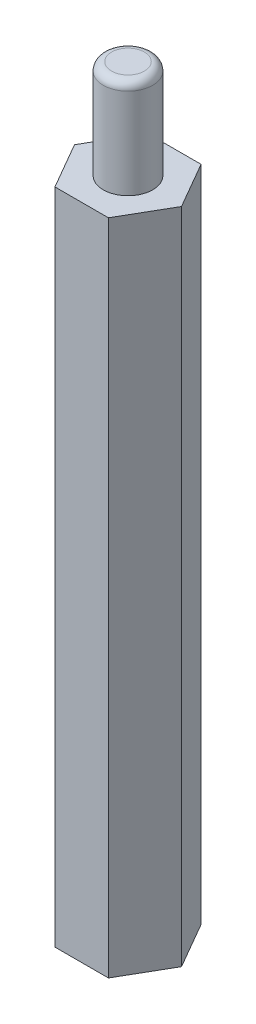
ISO-10303-21;
HEADER;
FILE_DESCRIPTION(('STEP AP214'),'2;1');
FILE_NAME('part.step','',(''),(''),'','','');
FILE_SCHEMA(('AUTOMOTIVE_DESIGN { 1 0 10303 214 1 1 1 1 }'));
ENDSEC;
DATA;
#1=APPLICATION_CONTEXT('core data for automotive mechanical design processes');
#2=APPLICATION_PROTOCOL_DEFINITION('international standard','automotive_design',2000,#1);
#3=PRODUCT_CONTEXT('',#1,'mechanical');
#4=PRODUCT('Part','Part','',(#3));
#5=PRODUCT_RELATED_PRODUCT_CATEGORY('part','',(#4));
#6=PRODUCT_DEFINITION_FORMATION('','',#4);
#7=PRODUCT_DEFINITION_CONTEXT('part definition',#1,'design');
#8=PRODUCT_DEFINITION('design','',#6,#7);
#9=PRODUCT_DEFINITION_SHAPE('','',#8);
#10=(LENGTH_UNIT() NAMED_UNIT(*) SI_UNIT(.MILLI.,.METRE.));
#11=(NAMED_UNIT(*) PLANE_ANGLE_UNIT() SI_UNIT($,.RADIAN.));
#12=(NAMED_UNIT(*) SI_UNIT($,.STERADIAN.) SOLID_ANGLE_UNIT());
#13=UNCERTAINTY_MEASURE_WITH_UNIT(LENGTH_MEASURE(1.E-05),#10,'distance_accuracy_value','');
#14=(GEOMETRIC_REPRESENTATION_CONTEXT(3) GLOBAL_UNCERTAINTY_ASSIGNED_CONTEXT((#13)) GLOBAL_UNIT_ASSIGNED_CONTEXT((#10,
#11,#12)) REPRESENTATION_CONTEXT('',''));
#15=CARTESIAN_POINT('',(0.,0.,0.));
#16=DIRECTION('',(0.,0.,1.));
#17=DIRECTION('',(1.,0.,0.));
#18=AXIS2_PLACEMENT_3D('',#15,#16,#17);
#19=CARTESIAN_POINT('',(0.,46.,0.));
#20=DIRECTION('',(0.,-1.,0.));
#21=DIRECTION('',(0.,0.,-1.));
#22=AXIS2_PLACEMENT_3D('',#19,#20,#21);
#23=CYLINDRICAL_SURFACE('',#22,1.5);
#24=CARTESIAN_POINT('',(0.,40.,0.));
#25=DIRECTION('',(0.,1.,0.));
#26=DIRECTION('',(0.,0.,1.));
#27=AXIS2_PLACEMENT_3D('',#24,#25,#26);
#28=CIRCLE('',#27,1.5);
#29=CARTESIAN_POINT('',(0.,40.,1.5));
#30=VERTEX_POINT('',#29);
#31=EDGE_CURVE('E138',#30,#30,#28,.T.);
#32=ORIENTED_EDGE('',*,*,#31,.T.);
#33=EDGE_LOOP('',(#32));
#34=FACE_BOUND('',#33,.T.);
#35=CARTESIAN_POINT('',(0.,45.5,0.));
#36=DIRECTION('',(0.,1.,0.));
#37=DIRECTION('',(0.,0.,1.));
#38=AXIS2_PLACEMENT_3D('',#35,#36,#37);
#39=CIRCLE('',#38,1.5);
#40=CARTESIAN_POINT('',(0.,45.5,1.5));
#41=VERTEX_POINT('',#40);
#42=EDGE_CURVE('E11',#41,#41,#39,.F.);
#43=ORIENTED_EDGE('',*,*,#42,.T.);
#44=EDGE_LOOP('',(#43));
#45=FACE_BOUND('',#44,.T.);
#46=ADVANCED_FACE('F41',(#34,#45),#23,.T.);
#47=CARTESIAN_POINT('',(0.,46.,0.));
#48=DIRECTION('',(0.,1.,0.));
#49=DIRECTION('',(0.,0.,1.));
#50=AXIS2_PLACEMENT_3D('',#47,#48,#49);
#51=PLANE('',#50);
#52=CARTESIAN_POINT('',(0.,46.,0.));
#53=DIRECTION('',(0.,1.,0.));
#54=DIRECTION('',(0.,0.,1.));
#55=AXIS2_PLACEMENT_3D('',#52,#53,#54);
#56=CIRCLE('',#55,1.);
#57=CARTESIAN_POINT('',(0.,46.,1.));
#58=VERTEX_POINT('',#57);
#59=EDGE_CURVE('E51',#58,#58,#56,.T.);
#60=ORIENTED_EDGE('',*,*,#59,.T.);
#61=EDGE_LOOP('',(#60));
#62=FACE_BOUND('',#61,.T.);
#63=ADVANCED_FACE('F167',(#62),#51,.T.);
#64=CARTESIAN_POINT('',(0.,45.5,0.));
#65=DIRECTION('',(0.,1.,0.));
#66=DIRECTION('',(0.,0.,1.));
#67=AXIS2_PLACEMENT_3D('',#64,#65,#66);
#68=TOROIDAL_SURFACE('',#67,1.,0.5);
#69=ORIENTED_EDGE('',*,*,#42,.F.);
#70=EDGE_LOOP('',(#69));
#71=FACE_BOUND('',#70,.T.);
#72=ORIENTED_EDGE('',*,*,#59,.F.);
#73=EDGE_LOOP('',(#72));
#74=FACE_BOUND('',#73,.T.);
#75=ADVANCED_FACE('F43',(#71,#74),#68,.T.);
#76=CARTESIAN_POINT('',(0.,40.,0.));
#77=DIRECTION('',(0.,1.,0.));
#78=DIRECTION('',(0.,0.,1.));
#79=AXIS2_PLACEMENT_3D('',#76,#77,#78);
#80=PLANE('',#79);
#81=DIRECTION('',(-1.,0.,0.));
#82=VECTOR('',#81,1.);
#83=CARTESIAN_POINT('',(1.62499999999999,40.,-2.81458256229941));
#84=LINE('',#83,#82);
#85=CARTESIAN_POINT('',(1.62499999999999,40.,-2.81458256229941));
#86=VERTEX_POINT('',#85);
#87=CARTESIAN_POINT('',(-1.62499999999999,40.,-2.81458256229941));
#88=VERTEX_POINT('',#87);
#89=EDGE_CURVE('E150',#86,#88,#84,.T.);
#90=ORIENTED_EDGE('',*,*,#89,.T.);
#91=DIRECTION('',(-0.5,0.,0.866025403784439));
#92=VECTOR('',#91,1.);
#93=CARTESIAN_POINT('',(-1.62499999999999,40.,-2.81458256229941));
#94=LINE('',#93,#92);
#95=CARTESIAN_POINT('',(-3.24999999999998,40.,0.));
#96=VERTEX_POINT('',#95);
#97=EDGE_CURVE('E97',#88,#96,#94,.T.);
#98=ORIENTED_EDGE('',*,*,#97,.T.);
#99=DIRECTION('',(0.5,0.,0.866025403784439));
#100=VECTOR('',#99,1.);
#101=CARTESIAN_POINT('',(-3.24999999999998,40.,0.));
#102=LINE('',#101,#100);
#103=CARTESIAN_POINT('',(-1.62499999999999,40.,2.81458256229941));
#104=VERTEX_POINT('',#103);
#105=EDGE_CURVE('E111',#96,#104,#102,.T.);
#106=ORIENTED_EDGE('',*,*,#105,.T.);
#107=DIRECTION('',(1.,0.,0.));
#108=VECTOR('',#107,1.);
#109=CARTESIAN_POINT('',(-1.62499999999999,40.,2.81458256229941));
#110=LINE('',#109,#108);
#111=CARTESIAN_POINT('',(1.62499999999999,40.,2.81458256229941));
#112=VERTEX_POINT('',#111);
#113=EDGE_CURVE('E104',#104,#112,#110,.T.);
#114=ORIENTED_EDGE('',*,*,#113,.T.);
#115=DIRECTION('',(0.5,0.,-0.866025403784438));
#116=VECTOR('',#115,1.);
#117=CARTESIAN_POINT('',(1.62499999999999,40.,2.81458256229941));
#118=LINE('',#117,#116);
#119=CARTESIAN_POINT('',(3.24999999999999,40.,0.));
#120=VERTEX_POINT('',#119);
#121=EDGE_CURVE('E109',#112,#120,#118,.T.);
#122=ORIENTED_EDGE('',*,*,#121,.T.);
#123=DIRECTION('',(-0.5,0.,-0.866025403784439));
#124=VECTOR('',#123,1.);
#125=CARTESIAN_POINT('',(3.24999999999999,40.,0.));
#126=LINE('',#125,#124);
#127=EDGE_CURVE('E59',#120,#86,#126,.T.);
#128=ORIENTED_EDGE('',*,*,#127,.T.);
#129=EDGE_LOOP('',(#90,#98,#106,#114,#122,#128));
#130=FACE_BOUND('',#129,.T.);
#131=ORIENTED_EDGE('',*,*,#31,.F.);
#132=EDGE_LOOP('',(#131));
#133=FACE_BOUND('',#132,.T.);
#134=ADVANCED_FACE('F106',(#130,#133),#80,.T.);
#135=CARTESIAN_POINT('',(1.62499999999999,40.,-2.81458256229941));
#136=DIRECTION('',(0.,0.,1.));
#137=DIRECTION('',(1.,0.,0.));
#138=AXIS2_PLACEMENT_3D('',#135,#136,#137);
#139=PLANE('',#138);
#140=DIRECTION('',(-1.,0.,0.));
#141=VECTOR('',#140,1.);
#142=CARTESIAN_POINT('',(1.62499999999999,0.,-2.81458256229941));
#143=LINE('',#142,#141);
#144=CARTESIAN_POINT('',(1.62499999999999,0.,-2.81458256229941));
#145=VERTEX_POINT('',#144);
#146=CARTESIAN_POINT('',(-1.62499999999999,0.,-2.81458256229941));
#147=VERTEX_POINT('',#146);
#148=EDGE_CURVE('E133',#145,#147,#143,.T.);
#149=ORIENTED_EDGE('',*,*,#148,.T.);
#150=DIRECTION('',(0.,-1.,0.));
#151=VECTOR('',#150,1.);
#152=CARTESIAN_POINT('',(-1.62499999999999,40.,-2.81458256229941));
#153=LINE('',#152,#151);
#154=EDGE_CURVE('E161',#88,#147,#153,.T.);
#155=ORIENTED_EDGE('',*,*,#154,.F.);
#156=ORIENTED_EDGE('',*,*,#89,.F.);
#157=DIRECTION('',(0.,-1.,0.));
#158=VECTOR('',#157,1.);
#159=CARTESIAN_POINT('',(1.62499999999999,40.,-2.81458256229941));
#160=LINE('',#159,#158);
#161=EDGE_CURVE('E129',#86,#145,#160,.T.);
#162=ORIENTED_EDGE('',*,*,#161,.T.);
#163=EDGE_LOOP('',(#149,#155,#156,#162));
#164=FACE_BOUND('',#163,.T.);
#165=ADVANCED_FACE('F175',(#164),#139,.F.);
#166=CARTESIAN_POINT('',(-1.62499999999999,40.,-2.81458256229941));
#167=DIRECTION('',(0.866025403784439,0.,0.5));
#168=DIRECTION('',(0.5,0.,-0.866025403784439));
#169=AXIS2_PLACEMENT_3D('',#166,#167,#168);
#170=PLANE('',#169);
#171=DIRECTION('',(-0.5,0.,0.866025403784439));
#172=VECTOR('',#171,1.);
#173=CARTESIAN_POINT('',(-1.62499999999999,0.,-2.81458256229941));
#174=LINE('',#173,#172);
#175=CARTESIAN_POINT('',(-3.24999999999998,0.,0.));
#176=VERTEX_POINT('',#175);
#177=EDGE_CURVE('E137',#147,#176,#174,.T.);
#178=ORIENTED_EDGE('',*,*,#177,.T.);
#179=DIRECTION('',(0.,-1.,0.));
#180=VECTOR('',#179,1.);
#181=CARTESIAN_POINT('',(-3.24999999999998,40.,0.));
#182=LINE('',#181,#180);
#183=EDGE_CURVE('E157',#96,#176,#182,.T.);
#184=ORIENTED_EDGE('',*,*,#183,.F.);
#185=ORIENTED_EDGE('',*,*,#97,.F.);
#186=ORIENTED_EDGE('',*,*,#154,.T.);
#187=EDGE_LOOP('',(#178,#184,#185,#186));
#188=FACE_BOUND('',#187,.T.);
#189=ADVANCED_FACE('F194',(#188),#170,.F.);
#190=CARTESIAN_POINT('',(-3.24999999999998,40.,0.));
#191=DIRECTION('',(0.866025403784439,0.,-0.5));
#192=DIRECTION('',(-0.5,0.,-0.866025403784439));
#193=AXIS2_PLACEMENT_3D('',#190,#191,#192);
#194=PLANE('',#193);
#195=DIRECTION('',(0.5,0.,0.866025403784439));
#196=VECTOR('',#195,1.);
#197=CARTESIAN_POINT('',(-3.24999999999998,0.,0.));
#198=LINE('',#197,#196);
#199=CARTESIAN_POINT('',(-1.62499999999999,0.,2.81458256229941));
#200=VERTEX_POINT('',#199);
#201=EDGE_CURVE('E141',#176,#200,#198,.T.);
#202=ORIENTED_EDGE('',*,*,#201,.T.);
#203=DIRECTION('',(0.,-1.,0.));
#204=VECTOR('',#203,1.);
#205=CARTESIAN_POINT('',(-1.62499999999999,40.,2.81458256229941));
#206=LINE('',#205,#204);
#207=EDGE_CURVE('E122',#104,#200,#206,.T.);
#208=ORIENTED_EDGE('',*,*,#207,.F.);
#209=ORIENTED_EDGE('',*,*,#105,.F.);
#210=ORIENTED_EDGE('',*,*,#183,.T.);
#211=EDGE_LOOP('',(#202,#208,#209,#210));
#212=FACE_BOUND('',#211,.T.);
#213=ADVANCED_FACE('F198',(#212),#194,.F.);
#214=CARTESIAN_POINT('',(-1.62499999999999,40.,2.81458256229941));
#215=DIRECTION('',(0.,0.,-1.));
#216=DIRECTION('',(-1.,0.,0.));
#217=AXIS2_PLACEMENT_3D('',#214,#215,#216);
#218=PLANE('',#217);
#219=DIRECTION('',(1.,0.,0.));
#220=VECTOR('',#219,1.);
#221=CARTESIAN_POINT('',(-1.62499999999999,0.,2.81458256229941));
#222=LINE('',#221,#220);
#223=CARTESIAN_POINT('',(1.62499999999999,0.,2.81458256229941));
#224=VERTEX_POINT('',#223);
#225=EDGE_CURVE('E120',#200,#224,#222,.T.);
#226=ORIENTED_EDGE('',*,*,#225,.T.);
#227=DIRECTION('',(0.,-1.,0.));
#228=VECTOR('',#227,1.);
#229=CARTESIAN_POINT('',(1.62499999999999,40.,2.81458256229941));
#230=LINE('',#229,#228);
#231=EDGE_CURVE('E117',#112,#224,#230,.T.);
#232=ORIENTED_EDGE('',*,*,#231,.F.);
#233=ORIENTED_EDGE('',*,*,#113,.F.);
#234=ORIENTED_EDGE('',*,*,#207,.T.);
#235=EDGE_LOOP('',(#226,#232,#233,#234));
#236=FACE_BOUND('',#235,.T.);
#237=ADVANCED_FACE('F118',(#236),#218,.F.);
#238=CARTESIAN_POINT('',(1.62499999999999,40.,2.81458256229941));
#239=DIRECTION('',(-0.866025403784438,0.,-0.5));
#240=DIRECTION('',(-0.5,0.,0.866025403784439));
#241=AXIS2_PLACEMENT_3D('',#238,#239,#240);
#242=PLANE('',#241);
#243=DIRECTION('',(0.5,0.,-0.866025403784438));
#244=VECTOR('',#243,1.);
#245=CARTESIAN_POINT('',(1.62499999999999,0.,2.81458256229941));
#246=LINE('',#245,#244);
#247=CARTESIAN_POINT('',(3.24999999999999,0.,0.));
#248=VERTEX_POINT('',#247);
#249=EDGE_CURVE('E82',#224,#248,#246,.T.);
#250=ORIENTED_EDGE('',*,*,#249,.T.);
#251=DIRECTION('',(0.,-1.,0.));
#252=VECTOR('',#251,1.);
#253=CARTESIAN_POINT('',(3.24999999999999,40.,0.));
#254=LINE('',#253,#252);
#255=EDGE_CURVE('E123',#120,#248,#254,.T.);
#256=ORIENTED_EDGE('',*,*,#255,.F.);
#257=ORIENTED_EDGE('',*,*,#121,.F.);
#258=ORIENTED_EDGE('',*,*,#231,.T.);
#259=EDGE_LOOP('',(#250,#256,#257,#258));
#260=FACE_BOUND('',#259,.T.);
#261=ADVANCED_FACE('F125',(#260),#242,.F.);
#262=CARTESIAN_POINT('',(3.24999999999999,40.,0.));
#263=DIRECTION('',(-0.866025403784439,0.,0.5));
#264=DIRECTION('',(0.5,0.,0.866025403784439));
#265=AXIS2_PLACEMENT_3D('',#262,#263,#264);
#266=PLANE('',#265);
#267=DIRECTION('',(-0.5,0.,-0.866025403784439));
#268=VECTOR('',#267,1.);
#269=CARTESIAN_POINT('',(3.24999999999999,0.,0.));
#270=LINE('',#269,#268);
#271=EDGE_CURVE('E88',#248,#145,#270,.T.);
#272=ORIENTED_EDGE('',*,*,#271,.T.);
#273=ORIENTED_EDGE('',*,*,#161,.F.);
#274=ORIENTED_EDGE('',*,*,#127,.F.);
#275=ORIENTED_EDGE('',*,*,#255,.T.);
#276=EDGE_LOOP('',(#272,#273,#274,#275));
#277=FACE_BOUND('',#276,.T.);
#278=ADVANCED_FACE('F189',(#277),#266,.F.);
#279=CARTESIAN_POINT('',(0.,0.,0.));
#280=DIRECTION('',(0.,1.,0.));
#281=DIRECTION('',(0.,0.,1.));
#282=AXIS2_PLACEMENT_3D('',#279,#280,#281);
#283=PLANE('',#282);
#284=CARTESIAN_POINT('',(0.,0.,0.));
#285=DIRECTION('',(0.,1.,0.));
#286=DIRECTION('',(0.,0.,1.));
#287=AXIS2_PLACEMENT_3D('',#284,#285,#286);
#288=CIRCLE('',#287,1.5);
#289=CARTESIAN_POINT('',(0.,0.,1.5));
#290=VERTEX_POINT('',#289);
#291=EDGE_CURVE('E220',#290,#290,#288,.T.);
#292=ORIENTED_EDGE('',*,*,#291,.T.);
#293=EDGE_LOOP('',(#292));
#294=FACE_BOUND('',#293,.T.);
#295=ORIENTED_EDGE('',*,*,#148,.F.);
#296=ORIENTED_EDGE('',*,*,#271,.F.);
#297=ORIENTED_EDGE('',*,*,#249,.F.);
#298=ORIENTED_EDGE('',*,*,#225,.F.);
#299=ORIENTED_EDGE('',*,*,#201,.F.);
#300=ORIENTED_EDGE('',*,*,#177,.F.);
#301=EDGE_LOOP('',(#295,#296,#297,#298,#299,#300));
#302=FACE_BOUND('',#301,.T.);
#303=ADVANCED_FACE('F186',(#294,#302),#283,.F.);
#304=CARTESIAN_POINT('',(0.,10.,0.));
#305=DIRECTION('',(0.,-1.,0.));
#306=DIRECTION('',(0.,0.,-1.));
#307=AXIS2_PLACEMENT_3D('',#304,#305,#306);
#308=CYLINDRICAL_SURFACE('',#307,1.5);
#309=CARTESIAN_POINT('',(0.,10.,0.));
#310=DIRECTION('',(0.,1.,0.));
#311=DIRECTION('',(0.,0.,1.));
#312=AXIS2_PLACEMENT_3D('',#309,#310,#311);
#313=CIRCLE('',#312,1.5);
#314=CARTESIAN_POINT('',(0.,10.,1.5));
#315=VERTEX_POINT('',#314);
#316=EDGE_CURVE('E218',#315,#315,#313,.T.);
#317=ORIENTED_EDGE('',*,*,#316,.T.);
#318=EDGE_LOOP('',(#317));
#319=FACE_BOUND('',#318,.T.);
#320=ORIENTED_EDGE('',*,*,#291,.F.);
#321=EDGE_LOOP('',(#320));
#322=FACE_BOUND('',#321,.T.);
#323=ADVANCED_FACE('F188',(#319,#322),#308,.F.);
#324=CARTESIAN_POINT('',(0.,10.,0.));
#325=DIRECTION('',(0.,1.,0.));
#326=DIRECTION('',(0.,0.,1.));
#327=AXIS2_PLACEMENT_3D('',#324,#325,#326);
#328=PLANE('',#327);
#329=ORIENTED_EDGE('',*,*,#316,.F.);
#330=EDGE_LOOP('',(#329));
#331=FACE_BOUND('',#330,.T.);
#332=ADVANCED_FACE('F210',(#331),#328,.F.);
#333=CLOSED_SHELL('',(#46,#63,#75,#134,#165,#189,#213,#237,#261,#278,#303,#323,#332));
#334=MANIFOLD_SOLID_BREP('B2',#333);
#335=ADVANCED_BREP_SHAPE_REPRESENTATION('',(#18,#334),#14);
#336=SHAPE_DEFINITION_REPRESENTATION(#9,#335);
ENDSEC;
END-ISO-10303-21;
